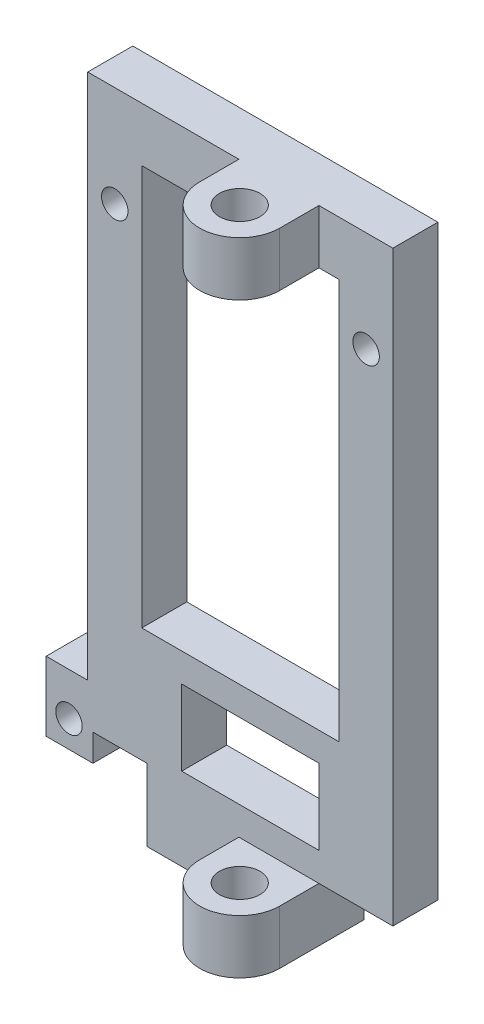
ISO-10303-21;
HEADER;
FILE_DESCRIPTION(('STEP AP214'),'2;1');
FILE_NAME('part.step','',(''),(''),'','','');
FILE_SCHEMA(('AUTOMOTIVE_DESIGN { 1 0 10303 214 1 1 1 1 }'));
ENDSEC;
DATA;
#1=APPLICATION_CONTEXT('core data for automotive mechanical design processes');
#2=APPLICATION_PROTOCOL_DEFINITION('international standard','automotive_design',2000,#1);
#3=PRODUCT_CONTEXT('',#1,'mechanical');
#4=PRODUCT('Part','Part','',(#3));
#5=PRODUCT_RELATED_PRODUCT_CATEGORY('part','',(#4));
#6=PRODUCT_DEFINITION_FORMATION('','',#4);
#7=PRODUCT_DEFINITION_CONTEXT('part definition',#1,'design');
#8=PRODUCT_DEFINITION('design','',#6,#7);
#9=PRODUCT_DEFINITION_SHAPE('','',#8);
#10=(LENGTH_UNIT() NAMED_UNIT(*) SI_UNIT(.MILLI.,.METRE.));
#11=(NAMED_UNIT(*) PLANE_ANGLE_UNIT() SI_UNIT($,.RADIAN.));
#12=(NAMED_UNIT(*) SI_UNIT($,.STERADIAN.) SOLID_ANGLE_UNIT());
#13=UNCERTAINTY_MEASURE_WITH_UNIT(LENGTH_MEASURE(1.E-05),#10,'distance_accuracy_value','');
#14=(GEOMETRIC_REPRESENTATION_CONTEXT(3) GLOBAL_UNCERTAINTY_ASSIGNED_CONTEXT((#13)) GLOBAL_UNIT_ASSIGNED_CONTEXT((#10,
#11,#12)) REPRESENTATION_CONTEXT('',''));
#15=CARTESIAN_POINT('',(0.,0.,0.));
#16=DIRECTION('',(0.,0.,1.));
#17=DIRECTION('',(1.,0.,0.));
#18=AXIS2_PLACEMENT_3D('',#15,#16,#17);
#19=CARTESIAN_POINT('',(0.,0.,5.));
#20=DIRECTION('',(0.,0.,1.));
#21=DIRECTION('',(1.,0.,0.));
#22=AXIS2_PLACEMENT_3D('',#19,#20,#21);
#23=PLANE('',#22);
#24=DIRECTION('',(1.,0.,0.));
#25=VECTOR('',#24,1.);
#26=CARTESIAN_POINT('',(0.,-14.863,5.));
#27=LINE('',#26,#25);
#28=CARTESIAN_POINT('',(-15.23,-14.863,5.));
#29=VERTEX_POINT('',#28);
#30=CARTESIAN_POINT('',(6.655,-14.863,5.));
#31=VERTEX_POINT('',#30);
#32=EDGE_CURVE('E357',#29,#31,#27,.T.);
#33=ORIENTED_EDGE('',*,*,#32,.F.);
#34=DIRECTION('',(0.,1.,0.));
#35=VECTOR('',#34,1.);
#36=CARTESIAN_POINT('',(-15.23,29.595,5.));
#37=LINE('',#36,#35);
#38=CARTESIAN_POINT('',(-15.23,29.595,5.));
#39=VERTEX_POINT('',#38);
#40=EDGE_CURVE('E490',#29,#39,#37,.T.);
#41=ORIENTED_EDGE('',*,*,#40,.T.);
#42=DIRECTION('',(-1.,0.,0.));
#43=VECTOR('',#42,1.);
#44=CARTESIAN_POINT('',(-15.65,29.595,5.));
#45=LINE('',#44,#43);
#46=CARTESIAN_POINT('',(-4.445,29.595,5.));
#47=VERTEX_POINT('',#46);
#48=EDGE_CURVE('E608',#47,#39,#45,.T.);
#49=ORIENTED_EDGE('',*,*,#48,.F.);
#50=DIRECTION('',(0.,-1.,0.));
#51=VECTOR('',#50,1.);
#52=CARTESIAN_POINT('',(-4.445,35.595,5.));
#53=LINE('',#52,#51);
#54=CARTESIAN_POINT('',(-4.445,35.595,5.));
#55=VERTEX_POINT('',#54);
#56=EDGE_CURVE('E585',#55,#47,#53,.T.);
#57=ORIENTED_EDGE('',*,*,#56,.F.);
#58=DIRECTION('',(-1.,0.,0.));
#59=VECTOR('',#58,1.);
#60=CARTESIAN_POINT('',(-21.65,35.595,5.));
#61=LINE('',#60,#59);
#62=CARTESIAN_POINT('',(-21.23,35.595,5.));
#63=VERTEX_POINT('',#62);
#64=EDGE_CURVE('E135',#55,#63,#61,.T.);
#65=ORIENTED_EDGE('',*,*,#64,.T.);
#66=DIRECTION('',(0.,1.,0.));
#67=VECTOR('',#66,1.);
#68=CARTESIAN_POINT('',(-21.23,35.595,5.));
#69=LINE('',#68,#67);
#70=CARTESIAN_POINT('',(-21.23,-22.895,5.));
#71=VERTEX_POINT('',#70);
#72=EDGE_CURVE('E480',#71,#63,#69,.T.);
#73=ORIENTED_EDGE('',*,*,#72,.F.);
#74=DIRECTION('',(1.,0.,0.));
#75=VECTOR('',#74,1.);
#76=CARTESIAN_POINT('',(-25.85,-22.895,5.));
#77=LINE('',#76,#75);
#78=CARTESIAN_POINT('',(-25.85,-22.895,5.));
#79=VERTEX_POINT('',#78);
#80=EDGE_CURVE('E454',#79,#71,#77,.T.);
#81=ORIENTED_EDGE('',*,*,#80,.F.);
#82=DIRECTION('',(0.,1.,0.));
#83=VECTOR('',#82,1.);
#84=CARTESIAN_POINT('',(-25.85,-35.595,5.));
#85=LINE('',#84,#83);
#86=CARTESIAN_POINT('',(-25.85,-30.595,5.));
#87=VERTEX_POINT('',#86);
#88=EDGE_CURVE('E441',#87,#79,#85,.T.);
#89=ORIENTED_EDGE('',*,*,#88,.F.);
#90=DIRECTION('',(1.,0.,0.));
#91=VECTOR('',#90,1.);
#92=CARTESIAN_POINT('',(0.,-30.595,5.));
#93=LINE('',#92,#91);
#94=CARTESIAN_POINT('',(-20.65,-30.595,5.));
#95=VERTEX_POINT('',#94);
#96=EDGE_CURVE('E410',#87,#95,#93,.T.);
#97=ORIENTED_EDGE('',*,*,#96,.T.);
#98=DIRECTION('',(0.,1.,0.));
#99=VECTOR('',#98,1.);
#100=CARTESIAN_POINT('',(-20.65,0.,5.));
#101=LINE('',#100,#99);
#102=CARTESIAN_POINT('',(-20.65,-27.595,5.));
#103=VERTEX_POINT('',#102);
#104=EDGE_CURVE('E387',#95,#103,#101,.T.);
#105=ORIENTED_EDGE('',*,*,#104,.T.);
#106=DIRECTION('',(-1.,0.,0.));
#107=VECTOR('',#106,1.);
#108=CARTESIAN_POINT('',(0.,-27.595,5.));
#109=LINE('',#108,#107);
#110=CARTESIAN_POINT('',(-14.65,-27.595,5.));
#111=VERTEX_POINT('',#110);
#112=EDGE_CURVE('E395',#111,#103,#109,.T.);
#113=ORIENTED_EDGE('',*,*,#112,.F.);
#114=DIRECTION('',(0.,1.,0.));
#115=VECTOR('',#114,1.);
#116=CARTESIAN_POINT('',(-14.65,0.,5.));
#117=LINE('',#116,#115);
#118=CARTESIAN_POINT('',(-14.65,-35.595,5.));
#119=VERTEX_POINT('',#118);
#120=EDGE_CURVE('E414',#119,#111,#117,.T.);
#121=ORIENTED_EDGE('',*,*,#120,.F.);
#122=DIRECTION('',(1.,0.,0.));
#123=VECTOR('',#122,1.);
#124=CARTESIAN_POINT('',(-21.65,-35.595,5.));
#125=LINE('',#124,#123);
#126=CARTESIAN_POINT('',(-4.445,-35.595,5.));
#127=VERTEX_POINT('',#126);
#128=EDGE_CURVE('E616',#119,#127,#125,.T.);
#129=ORIENTED_EDGE('',*,*,#128,.T.);
#130=DIRECTION('',(0.,-1.,0.));
#131=VECTOR('',#130,1.);
#132=CARTESIAN_POINT('',(-4.445,-29.595,5.));
#133=LINE('',#132,#131);
#134=CARTESIAN_POINT('',(-4.445,-29.595,5.));
#135=VERTEX_POINT('',#134);
#136=EDGE_CURVE('E581',#135,#127,#133,.T.);
#137=ORIENTED_EDGE('',*,*,#136,.F.);
#138=DIRECTION('',(1.,0.,0.));
#139=VECTOR('',#138,1.);
#140=CARTESIAN_POINT('',(6.655,-29.595,5.));
#141=LINE('',#140,#139);
#142=CARTESIAN_POINT('',(4.445,-29.595,5.));
#143=VERTEX_POINT('',#142);
#144=EDGE_CURVE('E475',#135,#143,#141,.T.);
#145=ORIENTED_EDGE('',*,*,#144,.T.);
#146=DIRECTION('',(-1.,0.,0.));
#147=VECTOR('',#146,1.);
#148=CARTESIAN_POINT('',(4.445,-29.595,5.));
#149=LINE('',#148,#147);
#150=CARTESIAN_POINT('',(12.65,-29.595,5.));
#151=VERTEX_POINT('',#150);
#152=EDGE_CURVE('E458',#151,#143,#149,.T.);
#153=ORIENTED_EDGE('',*,*,#152,.F.);
#154=DIRECTION('',(0.,-1.,0.));
#155=VECTOR('',#154,1.);
#156=CARTESIAN_POINT('',(12.65,35.595,5.));
#157=LINE('',#156,#155);
#158=CARTESIAN_POINT('',(12.65,35.595,5.));
#159=VERTEX_POINT('',#158);
#160=EDGE_CURVE('E506',#159,#151,#157,.T.);
#161=ORIENTED_EDGE('',*,*,#160,.F.);
#162=CARTESIAN_POINT('',(4.445,35.595,5.));
#163=VERTEX_POINT('',#162);
#164=EDGE_CURVE('E12',#159,#163,#61,.T.);
#165=ORIENTED_EDGE('',*,*,#164,.T.);
#166=DIRECTION('',(0.,-1.,0.));
#167=VECTOR('',#166,1.);
#168=CARTESIAN_POINT('',(4.445,35.595,5.));
#169=LINE('',#168,#167);
#170=CARTESIAN_POINT('',(4.445,29.595,5.));
#171=VERTEX_POINT('',#170);
#172=EDGE_CURVE('E589',#163,#171,#169,.T.);
#173=ORIENTED_EDGE('',*,*,#172,.T.);
#174=DIRECTION('',(-1.,0.,0.));
#175=VECTOR('',#174,1.);
#176=CARTESIAN_POINT('',(6.655,29.595,5.));
#177=LINE('',#176,#175);
#178=CARTESIAN_POINT('',(6.655,29.595,5.));
#179=VERTEX_POINT('',#178);
#180=EDGE_CURVE('E517',#179,#171,#177,.T.);
#181=ORIENTED_EDGE('',*,*,#180,.F.);
#182=DIRECTION('',(0.,1.,0.));
#183=VECTOR('',#182,1.);
#184=CARTESIAN_POINT('',(6.655,-29.595,5.));
#185=LINE('',#184,#183);
#186=EDGE_CURVE('E500',#31,#179,#185,.T.);
#187=ORIENTED_EDGE('',*,*,#186,.F.);
#188=EDGE_LOOP('',(#33,#41,#49,#57,#65,#73,#81,#89,#97,#105,#113,#121,#129,#137,#145,#153,#161,
#165,#173,#181,#187));
#189=FACE_BOUND('',#188,.T.);
#190=CARTESIAN_POINT('',(-18.23,24.405,5.));
#191=DIRECTION('',(0.,0.,1.));
#192=DIRECTION('',(1.,0.,0.));
#193=AXIS2_PLACEMENT_3D('',#190,#191,#192);
#194=CIRCLE('',#193,1.47);
#195=CARTESIAN_POINT('',(-16.76,24.405,5.));
#196=VERTEX_POINT('',#195);
#197=EDGE_CURVE('E372',#196,#196,#194,.T.);
#198=ORIENTED_EDGE('',*,*,#197,.F.);
#199=EDGE_LOOP('',(#198));
#200=FACE_BOUND('',#199,.T.);
#201=CARTESIAN_POINT('',(-23.31,-27.625,5.));
#202=DIRECTION('',(0.,0.,1.));
#203=DIRECTION('',(1.,0.,0.));
#204=AXIS2_PLACEMENT_3D('',#201,#202,#203);
#205=CIRCLE('',#204,1.47);
#206=CARTESIAN_POINT('',(-21.84,-27.625,5.));
#207=VERTEX_POINT('',#206);
#208=EDGE_CURVE('E371',#207,#207,#205,.T.);
#209=ORIENTED_EDGE('',*,*,#208,.F.);
#210=EDGE_LOOP('',(#209));
#211=FACE_BOUND('',#210,.T.);
#212=CARTESIAN_POINT('',(9.68,24.405,5.));
#213=DIRECTION('',(0.,0.,1.));
#214=DIRECTION('',(1.,0.,0.));
#215=AXIS2_PLACEMENT_3D('',#212,#213,#214);
#216=CIRCLE('',#215,1.47);
#217=CARTESIAN_POINT('',(11.15,24.405,5.));
#218=VERTEX_POINT('',#217);
#219=EDGE_CURVE('E346',#218,#218,#216,.T.);
#220=ORIENTED_EDGE('',*,*,#219,.F.);
#221=EDGE_LOOP('',(#220));
#222=FACE_BOUND('',#221,.T.);
#223=DIRECTION('',(-1.,0.,0.));
#224=VECTOR('',#223,1.);
#225=CARTESIAN_POINT('',(0.,-26.42,5.));
#226=LINE('',#225,#224);
#227=CARTESIAN_POINT('',(4.445,-26.42,5.));
#228=VERTEX_POINT('',#227);
#229=CARTESIAN_POINT('',(-10.795,-26.42,5.));
#230=VERTEX_POINT('',#229);
#231=EDGE_CURVE('E336',#228,#230,#226,.T.);
#232=ORIENTED_EDGE('',*,*,#231,.T.);
#233=DIRECTION('',(0.,1.,0.));
#234=VECTOR('',#233,1.);
#235=CARTESIAN_POINT('',(-10.795,0.,5.));
#236=LINE('',#235,#234);
#237=CARTESIAN_POINT('',(-10.795,-18.038,5.));
#238=VERTEX_POINT('',#237);
#239=EDGE_CURVE('E143',#230,#238,#236,.T.);
#240=ORIENTED_EDGE('',*,*,#239,.T.);
#241=DIRECTION('',(-1.,0.,0.));
#242=VECTOR('',#241,1.);
#243=CARTESIAN_POINT('',(0.,-18.038,5.));
#244=LINE('',#243,#242);
#245=CARTESIAN_POINT('',(4.445,-18.038,5.));
#246=VERTEX_POINT('',#245);
#247=EDGE_CURVE('E323',#246,#238,#244,.T.);
#248=ORIENTED_EDGE('',*,*,#247,.F.);
#249=DIRECTION('',(0.,1.,0.));
#250=VECTOR('',#249,1.);
#251=CARTESIAN_POINT('',(4.445,0.,5.));
#252=LINE('',#251,#250);
#253=EDGE_CURVE('E327',#228,#246,#252,.T.);
#254=ORIENTED_EDGE('',*,*,#253,.F.);
#255=EDGE_LOOP('',(#232,#240,#248,#254));
#256=FACE_BOUND('',#255,.T.);
#257=ADVANCED_FACE('F125',(#189,#200,#211,#222,#256),#23,.T.);
#258=CARTESIAN_POINT('',(0.,0.,0.));
#259=DIRECTION('',(0.,0.,1.));
#260=DIRECTION('',(1.,0.,0.));
#261=AXIS2_PLACEMENT_3D('',#258,#259,#260);
#262=PLANE('',#261);
#263=CARTESIAN_POINT('',(-18.23,24.405,0.));
#264=DIRECTION('',(0.,0.,1.));
#265=DIRECTION('',(1.,0.,0.));
#266=AXIS2_PLACEMENT_3D('',#263,#264,#265);
#267=CIRCLE('',#266,1.47);
#268=CARTESIAN_POINT('',(-16.76,24.405,0.));
#269=VERTEX_POINT('',#268);
#270=EDGE_CURVE('E367',#269,#269,#267,.T.);
#271=ORIENTED_EDGE('',*,*,#270,.T.);
#272=EDGE_LOOP('',(#271));
#273=FACE_BOUND('',#272,.T.);
#274=CARTESIAN_POINT('',(9.68,24.405,0.));
#275=DIRECTION('',(0.,0.,1.));
#276=DIRECTION('',(1.,0.,0.));
#277=AXIS2_PLACEMENT_3D('',#274,#275,#276);
#278=CIRCLE('',#277,1.47);
#279=CARTESIAN_POINT('',(11.15,24.405,0.));
#280=VERTEX_POINT('',#279);
#281=EDGE_CURVE('E376',#280,#280,#278,.T.);
#282=ORIENTED_EDGE('',*,*,#281,.T.);
#283=EDGE_LOOP('',(#282));
#284=FACE_BOUND('',#283,.T.);
#285=CARTESIAN_POINT('',(-23.31,-27.625,0.));
#286=DIRECTION('',(0.,0.,1.));
#287=DIRECTION('',(1.,0.,0.));
#288=AXIS2_PLACEMENT_3D('',#285,#286,#287);
#289=CIRCLE('',#288,1.47);
#290=CARTESIAN_POINT('',(-21.84,-27.625,0.));
#291=VERTEX_POINT('',#290);
#292=EDGE_CURVE('E383',#291,#291,#289,.T.);
#293=ORIENTED_EDGE('',*,*,#292,.T.);
#294=EDGE_LOOP('',(#293));
#295=FACE_BOUND('',#294,.T.);
#296=DIRECTION('',(1.,0.,0.));
#297=VECTOR('',#296,1.);
#298=CARTESIAN_POINT('',(-21.65,-35.595,0.));
#299=LINE('',#298,#297);
#300=CARTESIAN_POINT('',(-14.65,-35.595,0.));
#301=VERTEX_POINT('',#300);
#302=CARTESIAN_POINT('',(4.445,-35.595,0.));
#303=VERTEX_POINT('',#302);
#304=EDGE_CURVE('E612',#301,#303,#299,.T.);
#305=ORIENTED_EDGE('',*,*,#304,.F.);
#306=DIRECTION('',(0.,1.,0.));
#307=VECTOR('',#306,1.);
#308=CARTESIAN_POINT('',(-14.65,0.,0.));
#309=LINE('',#308,#307);
#310=CARTESIAN_POINT('',(-14.65,-27.595,0.));
#311=VERTEX_POINT('',#310);
#312=EDGE_CURVE('E398',#301,#311,#309,.T.);
#313=ORIENTED_EDGE('',*,*,#312,.T.);
#314=DIRECTION('',(-1.,0.,0.));
#315=VECTOR('',#314,1.);
#316=CARTESIAN_POINT('',(0.,-27.595,0.));
#317=LINE('',#316,#315);
#318=CARTESIAN_POINT('',(-20.65,-27.595,0.));
#319=VERTEX_POINT('',#318);
#320=EDGE_CURVE('E402',#311,#319,#317,.T.);
#321=ORIENTED_EDGE('',*,*,#320,.T.);
#322=DIRECTION('',(0.,1.,0.));
#323=VECTOR('',#322,1.);
#324=CARTESIAN_POINT('',(-20.65,0.,0.));
#325=LINE('',#324,#323);
#326=CARTESIAN_POINT('',(-20.65,-30.595,0.));
#327=VERTEX_POINT('',#326);
#328=EDGE_CURVE('E391',#327,#319,#325,.T.);
#329=ORIENTED_EDGE('',*,*,#328,.F.);
#330=DIRECTION('',(1.,0.,0.));
#331=VECTOR('',#330,1.);
#332=CARTESIAN_POINT('',(0.,-30.595,0.));
#333=LINE('',#332,#331);
#334=CARTESIAN_POINT('',(-25.85,-30.595,0.));
#335=VERTEX_POINT('',#334);
#336=EDGE_CURVE('E394',#335,#327,#333,.T.);
#337=ORIENTED_EDGE('',*,*,#336,.F.);
#338=DIRECTION('',(0.,-1.,0.));
#339=VECTOR('',#338,1.);
#340=CARTESIAN_POINT('',(-25.85,-35.595,0.));
#341=LINE('',#340,#339);
#342=CARTESIAN_POINT('',(-25.85,-22.895,0.));
#343=VERTEX_POINT('',#342);
#344=EDGE_CURVE('E437',#343,#335,#341,.T.);
#345=ORIENTED_EDGE('',*,*,#344,.F.);
#346=DIRECTION('',(1.,0.,0.));
#347=VECTOR('',#346,1.);
#348=CARTESIAN_POINT('',(-25.85,-22.895,0.));
#349=LINE('',#348,#347);
#350=CARTESIAN_POINT('',(-21.23,-22.895,0.));
#351=VERTEX_POINT('',#350);
#352=EDGE_CURVE('E447',#343,#351,#349,.T.);
#353=ORIENTED_EDGE('',*,*,#352,.T.);
#354=DIRECTION('',(0.,1.,0.));
#355=VECTOR('',#354,1.);
#356=CARTESIAN_POINT('',(-21.23,35.595,0.));
#357=LINE('',#356,#355);
#358=CARTESIAN_POINT('',(-21.23,35.595,0.));
#359=VERTEX_POINT('',#358);
#360=EDGE_CURVE('E481',#351,#359,#357,.T.);
#361=ORIENTED_EDGE('',*,*,#360,.T.);
#362=DIRECTION('',(-1.,0.,0.));
#363=VECTOR('',#362,1.);
#364=CARTESIAN_POINT('',(-21.65,35.595,0.));
#365=LINE('',#364,#363);
#366=CARTESIAN_POINT('',(12.65,35.595,0.));
#367=VERTEX_POINT('',#366);
#368=EDGE_CURVE('E618',#367,#359,#365,.T.);
#369=ORIENTED_EDGE('',*,*,#368,.F.);
#370=DIRECTION('',(0.,-1.,0.));
#371=VECTOR('',#370,1.);
#372=CARTESIAN_POINT('',(12.65,35.595,0.));
#373=LINE('',#372,#371);
#374=CARTESIAN_POINT('',(12.65,-29.595,0.));
#375=VERTEX_POINT('',#374);
#376=EDGE_CURVE('E501',#367,#375,#373,.T.);
#377=ORIENTED_EDGE('',*,*,#376,.T.);
#378=DIRECTION('',(-1.,0.,0.));
#379=VECTOR('',#378,1.);
#380=CARTESIAN_POINT('',(4.445,-29.595,0.));
#381=LINE('',#380,#379);
#382=CARTESIAN_POINT('',(4.445,-29.595,0.));
#383=VERTEX_POINT('',#382);
#384=EDGE_CURVE('E463',#375,#383,#381,.T.);
#385=ORIENTED_EDGE('',*,*,#384,.T.);
#386=DIRECTION('',(0.,-1.,0.));
#387=VECTOR('',#386,1.);
#388=CARTESIAN_POINT('',(4.445,-35.595,0.));
#389=LINE('',#388,#387);
#390=EDGE_CURVE('E459',#383,#303,#389,.T.);
#391=ORIENTED_EDGE('',*,*,#390,.T.);
#392=EDGE_LOOP('',(#305,#313,#321,#329,#337,#345,#353,#361,#369,#377,#385,#391));
#393=FACE_BOUND('',#392,.T.);
#394=DIRECTION('',(0.,1.,0.));
#395=VECTOR('',#394,1.);
#396=CARTESIAN_POINT('',(-15.23,29.595,0.));
#397=LINE('',#396,#395);
#398=CARTESIAN_POINT('',(-15.23,-14.863,0.));
#399=VERTEX_POINT('',#398);
#400=CARTESIAN_POINT('',(-15.23,29.595,0.));
#401=VERTEX_POINT('',#400);
#402=EDGE_CURVE('E491',#399,#401,#397,.T.);
#403=ORIENTED_EDGE('',*,*,#402,.F.);
#404=DIRECTION('',(1.,0.,0.));
#405=VECTOR('',#404,1.);
#406=CARTESIAN_POINT('',(0.,-14.863,0.));
#407=LINE('',#406,#405);
#408=CARTESIAN_POINT('',(6.655,-14.863,0.));
#409=VERTEX_POINT('',#408);
#410=EDGE_CURVE('E352',#399,#409,#407,.T.);
#411=ORIENTED_EDGE('',*,*,#410,.T.);
#412=DIRECTION('',(0.,1.,0.));
#413=VECTOR('',#412,1.);
#414=CARTESIAN_POINT('',(6.655,-29.595,0.));
#415=LINE('',#414,#413);
#416=CARTESIAN_POINT('',(6.655,29.595,0.));
#417=VERTEX_POINT('',#416);
#418=EDGE_CURVE('E514',#409,#417,#415,.T.);
#419=ORIENTED_EDGE('',*,*,#418,.T.);
#420=DIRECTION('',(-1.,0.,0.));
#421=VECTOR('',#420,1.);
#422=CARTESIAN_POINT('',(-15.65,29.595,0.));
#423=LINE('',#422,#421);
#424=EDGE_CURVE('E607',#417,#401,#423,.T.);
#425=ORIENTED_EDGE('',*,*,#424,.T.);
#426=EDGE_LOOP('',(#403,#411,#419,#425));
#427=FACE_BOUND('',#426,.T.);
#428=DIRECTION('',(0.,1.,0.));
#429=VECTOR('',#428,1.);
#430=CARTESIAN_POINT('',(-10.795,0.,0.));
#431=LINE('',#430,#429);
#432=CARTESIAN_POINT('',(-10.795,-26.42,0.));
#433=VERTEX_POINT('',#432);
#434=CARTESIAN_POINT('',(-10.795,-18.038,0.));
#435=VERTEX_POINT('',#434);
#436=EDGE_CURVE('E312',#433,#435,#431,.T.);
#437=ORIENTED_EDGE('',*,*,#436,.F.);
#438=DIRECTION('',(-1.,0.,0.));
#439=VECTOR('',#438,1.);
#440=CARTESIAN_POINT('',(0.,-26.42,0.));
#441=LINE('',#440,#439);
#442=CARTESIAN_POINT('',(4.445,-26.42,0.));
#443=VERTEX_POINT('',#442);
#444=EDGE_CURVE('E303',#443,#433,#441,.T.);
#445=ORIENTED_EDGE('',*,*,#444,.F.);
#446=DIRECTION('',(0.,1.,0.));
#447=VECTOR('',#446,1.);
#448=CARTESIAN_POINT('',(4.445,0.,0.));
#449=LINE('',#448,#447);
#450=CARTESIAN_POINT('',(4.445,-18.038,0.));
#451=VERTEX_POINT('',#450);
#452=EDGE_CURVE('E151',#443,#451,#449,.T.);
#453=ORIENTED_EDGE('',*,*,#452,.T.);
#454=DIRECTION('',(-1.,0.,0.));
#455=VECTOR('',#454,1.);
#456=CARTESIAN_POINT('',(0.,-18.038,0.));
#457=LINE('',#456,#455);
#458=EDGE_CURVE('E317',#451,#435,#457,.T.);
#459=ORIENTED_EDGE('',*,*,#458,.T.);
#460=EDGE_LOOP('',(#437,#445,#453,#459));
#461=FACE_BOUND('',#460,.T.);
#462=ADVANCED_FACE('F320',(#273,#284,#295,#393,#427,#461),#262,.F.);
#463=CARTESIAN_POINT('',(-25.85,0.,0.));
#464=DIRECTION('',(1.,0.,0.));
#465=DIRECTION('',(0.,0.,-1.));
#466=AXIS2_PLACEMENT_3D('',#463,#464,#465);
#467=PLANE('',#466);
#468=DIRECTION('',(0.,0.,1.));
#469=VECTOR('',#468,1.);
#470=CARTESIAN_POINT('',(-25.85,-30.595,0.));
#471=LINE('',#470,#469);
#472=EDGE_CURVE('E431',#335,#87,#471,.T.);
#473=ORIENTED_EDGE('',*,*,#472,.T.);
#474=ORIENTED_EDGE('',*,*,#88,.T.);
#475=DIRECTION('',(0.,0.,-1.));
#476=VECTOR('',#475,1.);
#477=CARTESIAN_POINT('',(-25.85,-22.895,0.));
#478=LINE('',#477,#476);
#479=EDGE_CURVE('E444',#79,#343,#478,.T.);
#480=ORIENTED_EDGE('',*,*,#479,.T.);
#481=ORIENTED_EDGE('',*,*,#344,.T.);
#482=EDGE_LOOP('',(#473,#474,#480,#481));
#483=FACE_BOUND('',#482,.T.);
#484=ADVANCED_FACE('F657',(#483),#467,.F.);
#485=CARTESIAN_POINT('',(-21.23,35.595,0.));
#486=DIRECTION('',(1.,0.,0.));
#487=DIRECTION('',(0.,1.,0.));
#488=AXIS2_PLACEMENT_3D('',#485,#486,#487);
#489=PLANE('',#488);
#490=DIRECTION('',(0.,0.,-1.));
#491=VECTOR('',#490,1.);
#492=CARTESIAN_POINT('',(-21.23,-22.895,0.));
#493=LINE('',#492,#491);
#494=EDGE_CURVE('E424',#71,#351,#493,.T.);
#495=ORIENTED_EDGE('',*,*,#494,.F.);
#496=ORIENTED_EDGE('',*,*,#72,.T.);
#497=DIRECTION('',(0.,0.,1.));
#498=VECTOR('',#497,1.);
#499=CARTESIAN_POINT('',(-21.23,35.595,0.));
#500=LINE('',#499,#498);
#501=EDGE_CURVE('E484',#359,#63,#500,.T.);
#502=ORIENTED_EDGE('',*,*,#501,.F.);
#503=ORIENTED_EDGE('',*,*,#360,.F.);
#504=EDGE_LOOP('',(#495,#496,#502,#503));
#505=FACE_BOUND('',#504,.T.);
#506=ADVANCED_FACE('F667',(#505),#489,.F.);
#507=CARTESIAN_POINT('',(-21.65,-35.595,5.));
#508=DIRECTION('',(0.,1.,0.));
#509=DIRECTION('',(0.,0.,1.));
#510=AXIS2_PLACEMENT_3D('',#507,#508,#509);
#511=PLANE('',#510);
#512=ORIENTED_EDGE('',*,*,#128,.F.);
#513=DIRECTION('',(0.,0.,1.));
#514=VECTOR('',#513,1.);
#515=CARTESIAN_POINT('',(-14.65,-35.595,0.));
#516=LINE('',#515,#514);
#517=EDGE_CURVE('E428',#301,#119,#516,.T.);
#518=ORIENTED_EDGE('',*,*,#517,.F.);
#519=ORIENTED_EDGE('',*,*,#304,.T.);
#520=DIRECTION('',(0.,0.,-1.));
#521=VECTOR('',#520,1.);
#522=CARTESIAN_POINT('',(4.445,-35.595,13.8));
#523=LINE('',#522,#521);
#524=CARTESIAN_POINT('',(4.445,-35.595,9.40000000000001));
#525=VERTEX_POINT('',#524);
#526=EDGE_CURVE('E569',#525,#303,#523,.T.);
#527=ORIENTED_EDGE('',*,*,#526,.F.);
#528=CARTESIAN_POINT('',(0.,-35.595,9.35476988636363));
#529=DIRECTION('',(0.,1.,0.));
#530=DIRECTION('',(0.,0.,1.));
#531=AXIS2_PLACEMENT_3D('',#528,#529,#530);
#532=CIRCLE('',#531,4.44523011363636);
#533=CARTESIAN_POINT('',(-4.445,-35.595,9.40000000000001));
#534=VERTEX_POINT('',#533);
#535=EDGE_CURVE('E546',#525,#534,#532,.F.);
#536=ORIENTED_EDGE('',*,*,#535,.T.);
#537=DIRECTION('',(0.,0.,-1.));
#538=VECTOR('',#537,1.);
#539=CARTESIAN_POINT('',(-4.445,-35.595,13.8));
#540=LINE('',#539,#538);
#541=EDGE_CURVE('E565',#534,#127,#540,.T.);
#542=ORIENTED_EDGE('',*,*,#541,.T.);
#543=EDGE_LOOP('',(#512,#518,#519,#527,#536,#542));
#544=FACE_BOUND('',#543,.T.);
#545=CARTESIAN_POINT('',(0.,-35.595,9.35476988636363));
#546=DIRECTION('',(0.,1.,0.));
#547=DIRECTION('',(0.,0.,1.));
#548=AXIS2_PLACEMENT_3D('',#545,#546,#547);
#549=CIRCLE('',#548,2.2479);
#550=CARTESIAN_POINT('',(0.,-35.595,11.6026698863636));
#551=VERTEX_POINT('',#550);
#552=EDGE_CURVE('E513',#551,#551,#549,.T.);
#553=ORIENTED_EDGE('',*,*,#552,.T.);
#554=EDGE_LOOP('',(#553));
#555=FACE_BOUND('',#554,.T.);
#556=ADVANCED_FACE('F127',(#544,#555),#511,.F.);
#557=CARTESIAN_POINT('',(-21.65,35.595,5.));
#558=DIRECTION('',(0.,-1.,0.));
#559=DIRECTION('',(0.,0.,-1.));
#560=AXIS2_PLACEMENT_3D('',#557,#558,#559);
#561=PLANE('',#560);
#562=ORIENTED_EDGE('',*,*,#368,.T.);
#563=ORIENTED_EDGE('',*,*,#501,.T.);
#564=ORIENTED_EDGE('',*,*,#64,.F.);
#565=DIRECTION('',(0.,0.,-1.));
#566=VECTOR('',#565,1.);
#567=CARTESIAN_POINT('',(-4.445,35.595,13.8));
#568=LINE('',#567,#566);
#569=CARTESIAN_POINT('',(-4.445,35.595,9.40000000000001));
#570=VERTEX_POINT('',#569);
#571=EDGE_CURVE('E593',#570,#55,#568,.T.);
#572=ORIENTED_EDGE('',*,*,#571,.F.);
#573=CARTESIAN_POINT('',(0.,35.595,9.35476988636363));
#574=DIRECTION('',(0.,1.,0.));
#575=DIRECTION('',(0.,0.,1.));
#576=AXIS2_PLACEMENT_3D('',#573,#574,#575);
#577=CIRCLE('',#576,4.44523011363636);
#578=CARTESIAN_POINT('',(4.445,35.595,9.40000000000001));
#579=VERTEX_POINT('',#578);
#580=EDGE_CURVE('E129',#579,#570,#577,.F.);
#581=ORIENTED_EDGE('',*,*,#580,.F.);
#582=DIRECTION('',(0.,0.,-1.));
#583=VECTOR('',#582,1.);
#584=CARTESIAN_POINT('',(4.445,35.595,13.8));
#585=LINE('',#584,#583);
#586=EDGE_CURVE('E596',#579,#163,#585,.T.);
#587=ORIENTED_EDGE('',*,*,#586,.T.);
#588=ORIENTED_EDGE('',*,*,#164,.F.);
#589=DIRECTION('',(0.,0.,1.));
#590=VECTOR('',#589,1.);
#591=CARTESIAN_POINT('',(12.65,35.595,0.));
#592=LINE('',#591,#590);
#593=EDGE_CURVE('E505',#367,#159,#592,.T.);
#594=ORIENTED_EDGE('',*,*,#593,.F.);
#595=EDGE_LOOP('',(#562,#563,#564,#572,#581,#587,#588,#594));
#596=FACE_BOUND('',#595,.T.);
#597=CARTESIAN_POINT('',(0.,35.595,9.35476988636363));
#598=DIRECTION('',(0.,-1.,0.));
#599=DIRECTION('',(0.,0.,-1.));
#600=AXIS2_PLACEMENT_3D('',#597,#598,#599);
#601=CIRCLE('',#600,2.2479);
#602=CARTESIAN_POINT('',(0.,35.595,7.10686988636363));
#603=VERTEX_POINT('',#602);
#604=EDGE_CURVE('E542',#603,#603,#601,.T.);
#605=ORIENTED_EDGE('',*,*,#604,.T.);
#606=EDGE_LOOP('',(#605));
#607=FACE_BOUND('',#606,.T.);
#608=ADVANCED_FACE('F646',(#596,#607),#561,.F.);
#609=CARTESIAN_POINT('',(-15.65,-29.595,5.));
#610=DIRECTION('',(0.,1.,0.));
#611=DIRECTION('',(0.,0.,1.));
#612=AXIS2_PLACEMENT_3D('',#609,#610,#611);
#613=PLANE('',#612);
#614=ORIENTED_EDGE('',*,*,#144,.F.);
#615=DIRECTION('',(0.,0.,-1.));
#616=VECTOR('',#615,1.);
#617=CARTESIAN_POINT('',(-4.445,-29.595,13.8));
#618=LINE('',#617,#616);
#619=CARTESIAN_POINT('',(-4.445,-29.595,9.40000000000001));
#620=VERTEX_POINT('',#619);
#621=EDGE_CURVE('E577',#620,#135,#618,.T.);
#622=ORIENTED_EDGE('',*,*,#621,.F.);
#623=CARTESIAN_POINT('',(0.,-29.595,9.35476988636363));
#624=DIRECTION('',(0.,1.,0.));
#625=DIRECTION('',(0.,0.,1.));
#626=AXIS2_PLACEMENT_3D('',#623,#624,#625);
#627=CIRCLE('',#626,4.44523011363636);
#628=CARTESIAN_POINT('',(4.445,-29.595,9.40000000000001));
#629=VERTEX_POINT('',#628);
#630=EDGE_CURVE('E562',#629,#620,#627,.F.);
#631=ORIENTED_EDGE('',*,*,#630,.F.);
#632=DIRECTION('',(0.,0.,-1.));
#633=VECTOR('',#632,1.);
#634=CARTESIAN_POINT('',(4.445,-29.595,13.8));
#635=LINE('',#634,#633);
#636=EDGE_CURVE('E573',#629,#143,#635,.T.);
#637=ORIENTED_EDGE('',*,*,#636,.T.);
#638=EDGE_LOOP('',(#614,#622,#631,#637));
#639=FACE_BOUND('',#638,.T.);
#640=CARTESIAN_POINT('',(0.,-29.595,9.35476988636363));
#641=DIRECTION('',(0.,1.,0.));
#642=DIRECTION('',(0.,0.,1.));
#643=AXIS2_PLACEMENT_3D('',#640,#641,#642);
#644=CIRCLE('',#643,2.2479);
#645=CARTESIAN_POINT('',(0.,-29.595,11.6026698863636));
#646=VERTEX_POINT('',#645);
#647=EDGE_CURVE('E538',#646,#646,#644,.T.);
#648=ORIENTED_EDGE('',*,*,#647,.F.);
#649=EDGE_LOOP('',(#648));
#650=FACE_BOUND('',#649,.T.);
#651=ADVANCED_FACE('F634',(#639,#650),#613,.T.);
#652=CARTESIAN_POINT('',(-15.65,29.595,5.));
#653=DIRECTION('',(0.,-1.,0.));
#654=DIRECTION('',(0.,0.,-1.));
#655=AXIS2_PLACEMENT_3D('',#652,#653,#654);
#656=PLANE('',#655);
#657=DIRECTION('',(0.,0.,1.));
#658=VECTOR('',#657,1.);
#659=CARTESIAN_POINT('',(-15.23,29.595,0.));
#660=LINE('',#659,#658);
#661=EDGE_CURVE('E494',#401,#39,#660,.T.);
#662=ORIENTED_EDGE('',*,*,#661,.F.);
#663=ORIENTED_EDGE('',*,*,#424,.F.);
#664=DIRECTION('',(0.,0.,1.));
#665=VECTOR('',#664,1.);
#666=CARTESIAN_POINT('',(6.655,29.595,0.));
#667=LINE('',#666,#665);
#668=EDGE_CURVE('E510',#417,#179,#667,.T.);
#669=ORIENTED_EDGE('',*,*,#668,.T.);
#670=ORIENTED_EDGE('',*,*,#180,.T.);
#671=DIRECTION('',(0.,0.,-1.));
#672=VECTOR('',#671,1.);
#673=CARTESIAN_POINT('',(4.445,29.595,13.8));
#674=LINE('',#673,#672);
#675=CARTESIAN_POINT('',(4.445,29.595,9.40000000000001));
#676=VERTEX_POINT('',#675);
#677=EDGE_CURVE('E600',#676,#171,#674,.T.);
#678=ORIENTED_EDGE('',*,*,#677,.F.);
#679=CARTESIAN_POINT('',(0.,29.595,9.35476988636363));
#680=DIRECTION('',(0.,-1.,0.));
#681=DIRECTION('',(0.,0.,-1.));
#682=AXIS2_PLACEMENT_3D('',#679,#680,#681);
#683=CIRCLE('',#682,4.44523011363636);
#684=CARTESIAN_POINT('',(-4.445,29.595,9.40000000000001));
#685=VERTEX_POINT('',#684);
#686=EDGE_CURVE('E555',#685,#676,#683,.F.);
#687=ORIENTED_EDGE('',*,*,#686,.F.);
#688=DIRECTION('',(0.,0.,-1.));
#689=VECTOR('',#688,1.);
#690=CARTESIAN_POINT('',(-4.445,29.595,13.8));
#691=LINE('',#690,#689);
#692=EDGE_CURVE('E604',#685,#47,#691,.T.);
#693=ORIENTED_EDGE('',*,*,#692,.T.);
#694=ORIENTED_EDGE('',*,*,#48,.T.);
#695=EDGE_LOOP('',(#662,#663,#669,#670,#678,#687,#693,#694));
#696=FACE_BOUND('',#695,.T.);
#697=CARTESIAN_POINT('',(0.,29.595,9.35476988636363));
#698=DIRECTION('',(0.,-1.,0.));
#699=DIRECTION('',(0.,0.,-1.));
#700=AXIS2_PLACEMENT_3D('',#697,#698,#699);
#701=CIRCLE('',#700,2.2479);
#702=CARTESIAN_POINT('',(0.,29.595,7.10686988636363));
#703=VERTEX_POINT('',#702);
#704=EDGE_CURVE('E533',#703,#703,#701,.T.);
#705=ORIENTED_EDGE('',*,*,#704,.F.);
#706=EDGE_LOOP('',(#705));
#707=FACE_BOUND('',#706,.T.);
#708=ADVANCED_FACE('F631',(#696,#707),#656,.T.);
#709=CARTESIAN_POINT('',(-4.445,35.595,13.8));
#710=DIRECTION('',(1.,0.,0.));
#711=DIRECTION('',(0.,1.,0.));
#712=AXIS2_PLACEMENT_3D('',#709,#710,#711);
#713=PLANE('',#712);
#714=ORIENTED_EDGE('',*,*,#692,.F.);
#715=DIRECTION('',(0.,1.,0.));
#716=VECTOR('',#715,1.);
#717=CARTESIAN_POINT('',(-4.445,-35.595,9.40000000000001));
#718=LINE('',#717,#716);
#719=EDGE_CURVE('E550',#685,#570,#718,.T.);
#720=ORIENTED_EDGE('',*,*,#719,.T.);
#721=ORIENTED_EDGE('',*,*,#571,.T.);
#722=ORIENTED_EDGE('',*,*,#56,.T.);
#723=EDGE_LOOP('',(#714,#720,#721,#722));
#724=FACE_BOUND('',#723,.T.);
#725=ADVANCED_FACE('F633',(#724),#713,.F.);
#726=CARTESIAN_POINT('',(4.445,35.595,13.8));
#727=DIRECTION('',(1.,0.,0.));
#728=DIRECTION('',(0.,1.,0.));
#729=AXIS2_PLACEMENT_3D('',#726,#727,#728);
#730=PLANE('',#729);
#731=DIRECTION('',(0.,1.,0.));
#732=VECTOR('',#731,1.);
#733=CARTESIAN_POINT('',(4.445,-35.595,9.40000000000001));
#734=LINE('',#733,#732);
#735=EDGE_CURVE('E528',#676,#579,#734,.T.);
#736=ORIENTED_EDGE('',*,*,#735,.F.);
#737=ORIENTED_EDGE('',*,*,#677,.T.);
#738=ORIENTED_EDGE('',*,*,#172,.F.);
#739=ORIENTED_EDGE('',*,*,#586,.F.);
#740=EDGE_LOOP('',(#736,#737,#738,#739));
#741=FACE_BOUND('',#740,.T.);
#742=ADVANCED_FACE('F642',(#741),#730,.T.);
#743=CARTESIAN_POINT('',(-4.445,-29.595,13.8));
#744=DIRECTION('',(1.,0.,0.));
#745=DIRECTION('',(0.,0.,-1.));
#746=AXIS2_PLACEMENT_3D('',#743,#744,#745);
#747=PLANE('',#746);
#748=ORIENTED_EDGE('',*,*,#541,.F.);
#749=EDGE_CURVE('E551',#534,#620,#718,.T.);
#750=ORIENTED_EDGE('',*,*,#749,.T.);
#751=ORIENTED_EDGE('',*,*,#621,.T.);
#752=ORIENTED_EDGE('',*,*,#136,.T.);
#753=EDGE_LOOP('',(#748,#750,#751,#752));
#754=FACE_BOUND('',#753,.T.);
#755=ADVANCED_FACE('F689',(#754),#747,.F.);
#756=CARTESIAN_POINT('',(4.445,-29.595,13.8));
#757=DIRECTION('',(1.,0.,0.));
#758=DIRECTION('',(0.,0.,-1.));
#759=AXIS2_PLACEMENT_3D('',#756,#757,#758);
#760=PLANE('',#759);
#761=EDGE_CURVE('E529',#525,#629,#734,.T.);
#762=ORIENTED_EDGE('',*,*,#761,.F.);
#763=ORIENTED_EDGE('',*,*,#526,.T.);
#764=ORIENTED_EDGE('',*,*,#390,.F.);
#765=DIRECTION('',(0.,0.,1.));
#766=VECTOR('',#765,1.);
#767=CARTESIAN_POINT('',(4.445,-29.595,0.));
#768=LINE('',#767,#766);
#769=EDGE_CURVE('E471',#383,#143,#768,.T.);
#770=ORIENTED_EDGE('',*,*,#769,.T.);
#771=ORIENTED_EDGE('',*,*,#636,.F.);
#772=EDGE_LOOP('',(#762,#763,#764,#770,#771));
#773=FACE_BOUND('',#772,.T.);
#774=ADVANCED_FACE('F692',(#773),#760,.T.);
#775=CARTESIAN_POINT('',(0.,-35.595,9.35476988636363));
#776=DIRECTION('',(0.,1.,0.));
#777=DIRECTION('',(0.,0.,1.));
#778=AXIS2_PLACEMENT_3D('',#775,#776,#777);
#779=CYLINDRICAL_SURFACE('',#778,4.44523011363636);
#780=ORIENTED_EDGE('',*,*,#630,.T.);
#781=ORIENTED_EDGE('',*,*,#749,.F.);
#782=ORIENTED_EDGE('',*,*,#535,.F.);
#783=ORIENTED_EDGE('',*,*,#761,.T.);
#784=EDGE_LOOP('',(#780,#781,#782,#783));
#785=FACE_BOUND('',#784,.T.);
#786=ADVANCED_FACE('F683',(#785),#779,.T.);
#787=ORIENTED_EDGE('',*,*,#719,.F.);
#788=ORIENTED_EDGE('',*,*,#686,.T.);
#789=ORIENTED_EDGE('',*,*,#735,.T.);
#790=ORIENTED_EDGE('',*,*,#580,.T.);
#791=EDGE_LOOP('',(#787,#788,#789,#790));
#792=FACE_BOUND('',#791,.T.);
#793=ADVANCED_FACE('F675',(#792),#779,.T.);
#794=CARTESIAN_POINT('',(0.,-35.595,9.35476988636363));
#795=DIRECTION('',(0.,1.,0.));
#796=DIRECTION('',(0.,0.,1.));
#797=AXIS2_PLACEMENT_3D('',#794,#795,#796);
#798=CYLINDRICAL_SURFACE('',#797,2.2479);
#799=ORIENTED_EDGE('',*,*,#704,.T.);
#800=EDGE_LOOP('',(#799));
#801=FACE_BOUND('',#800,.T.);
#802=ORIENTED_EDGE('',*,*,#604,.F.);
#803=EDGE_LOOP('',(#802));
#804=FACE_BOUND('',#803,.T.);
#805=ADVANCED_FACE('F628',(#801,#804),#798,.F.);
#806=ORIENTED_EDGE('',*,*,#647,.T.);
#807=EDGE_LOOP('',(#806));
#808=FACE_BOUND('',#807,.T.);
#809=ORIENTED_EDGE('',*,*,#552,.F.);
#810=EDGE_LOOP('',(#809));
#811=FACE_BOUND('',#810,.T.);
#812=ADVANCED_FACE('F674',(#808,#811),#798,.F.);
#813=CARTESIAN_POINT('',(6.655,-29.595,0.));
#814=DIRECTION('',(1.,0.,0.));
#815=DIRECTION('',(0.,0.,-1.));
#816=AXIS2_PLACEMENT_3D('',#813,#814,#815);
#817=PLANE('',#816);
#818=ORIENTED_EDGE('',*,*,#418,.F.);
#819=DIRECTION('',(0.,0.,1.));
#820=VECTOR('',#819,1.);
#821=CARTESIAN_POINT('',(6.655,-14.863,0.));
#822=LINE('',#821,#820);
#823=EDGE_CURVE('E337',#409,#31,#822,.T.);
#824=ORIENTED_EDGE('',*,*,#823,.T.);
#825=ORIENTED_EDGE('',*,*,#186,.T.);
#826=ORIENTED_EDGE('',*,*,#668,.F.);
#827=EDGE_LOOP('',(#818,#824,#825,#826));
#828=FACE_BOUND('',#827,.T.);
#829=ADVANCED_FACE('F681',(#828),#817,.F.);
#830=CARTESIAN_POINT('',(12.65,35.595,0.));
#831=DIRECTION('',(-1.,0.,0.));
#832=DIRECTION('',(0.,-1.,0.));
#833=AXIS2_PLACEMENT_3D('',#830,#831,#832);
#834=PLANE('',#833);
#835=ORIENTED_EDGE('',*,*,#160,.T.);
#836=DIRECTION('',(0.,0.,1.));
#837=VECTOR('',#836,1.);
#838=CARTESIAN_POINT('',(12.65,-29.595,0.));
#839=LINE('',#838,#837);
#840=EDGE_CURVE('E467',#375,#151,#839,.T.);
#841=ORIENTED_EDGE('',*,*,#840,.F.);
#842=ORIENTED_EDGE('',*,*,#376,.F.);
#843=ORIENTED_EDGE('',*,*,#593,.T.);
#844=EDGE_LOOP('',(#835,#841,#842,#843));
#845=FACE_BOUND('',#844,.T.);
#846=ADVANCED_FACE('F765',(#845),#834,.F.);
#847=CARTESIAN_POINT('',(-15.23,29.595,0.));
#848=DIRECTION('',(1.,0.,0.));
#849=DIRECTION('',(0.,1.,0.));
#850=AXIS2_PLACEMENT_3D('',#847,#848,#849);
#851=PLANE('',#850);
#852=ORIENTED_EDGE('',*,*,#40,.F.);
#853=DIRECTION('',(0.,0.,1.));
#854=VECTOR('',#853,1.);
#855=CARTESIAN_POINT('',(-15.23,-14.863,0.));
#856=LINE('',#855,#854);
#857=EDGE_CURVE('E356',#399,#29,#856,.T.);
#858=ORIENTED_EDGE('',*,*,#857,.F.);
#859=ORIENTED_EDGE('',*,*,#402,.T.);
#860=ORIENTED_EDGE('',*,*,#661,.T.);
#861=EDGE_LOOP('',(#852,#858,#859,#860));
#862=FACE_BOUND('',#861,.T.);
#863=ADVANCED_FACE('F767',(#862),#851,.T.);
#864=CARTESIAN_POINT('',(4.445,-29.595,0.));
#865=DIRECTION('',(0.,1.,0.));
#866=DIRECTION('',(0.,0.,1.));
#867=AXIS2_PLACEMENT_3D('',#864,#865,#866);
#868=PLANE('',#867);
#869=ORIENTED_EDGE('',*,*,#152,.T.);
#870=ORIENTED_EDGE('',*,*,#769,.F.);
#871=ORIENTED_EDGE('',*,*,#384,.F.);
#872=ORIENTED_EDGE('',*,*,#840,.T.);
#873=EDGE_LOOP('',(#869,#870,#871,#872));
#874=FACE_BOUND('',#873,.T.);
#875=ADVANCED_FACE('F760',(#874),#868,.F.);
#876=CARTESIAN_POINT('',(-25.85,-22.895,0.));
#877=DIRECTION('',(0.,-1.,0.));
#878=DIRECTION('',(1.,0.,0.));
#879=AXIS2_PLACEMENT_3D('',#876,#877,#878);
#880=PLANE('',#879);
#881=ORIENTED_EDGE('',*,*,#494,.T.);
#882=ORIENTED_EDGE('',*,*,#352,.F.);
#883=ORIENTED_EDGE('',*,*,#479,.F.);
#884=ORIENTED_EDGE('',*,*,#80,.T.);
#885=EDGE_LOOP('',(#881,#882,#883,#884));
#886=FACE_BOUND('',#885,.T.);
#887=ADVANCED_FACE('F726',(#886),#880,.F.);
#888=CARTESIAN_POINT('',(-20.65,0.,0.));
#889=DIRECTION('',(1.,0.,0.));
#890=DIRECTION('',(0.,0.,-1.));
#891=AXIS2_PLACEMENT_3D('',#888,#889,#890);
#892=PLANE('',#891);
#893=ORIENTED_EDGE('',*,*,#104,.F.);
#894=DIRECTION('',(0.,0.,1.));
#895=VECTOR('',#894,1.);
#896=CARTESIAN_POINT('',(-20.65,-30.595,0.));
#897=LINE('',#896,#895);
#898=EDGE_CURVE('E406',#327,#95,#897,.T.);
#899=ORIENTED_EDGE('',*,*,#898,.F.);
#900=ORIENTED_EDGE('',*,*,#328,.T.);
#901=DIRECTION('',(0.,0.,1.));
#902=VECTOR('',#901,1.);
#903=CARTESIAN_POINT('',(-20.65,-27.595,0.));
#904=LINE('',#903,#902);
#905=EDGE_CURVE('E421',#319,#103,#904,.T.);
#906=ORIENTED_EDGE('',*,*,#905,.T.);
#907=EDGE_LOOP('',(#893,#899,#900,#906));
#908=FACE_BOUND('',#907,.T.);
#909=ADVANCED_FACE('F742',(#908),#892,.T.);
#910=CARTESIAN_POINT('',(0.,-27.595,0.));
#911=DIRECTION('',(0.,1.,0.));
#912=DIRECTION('',(0.,0.,1.));
#913=AXIS2_PLACEMENT_3D('',#910,#911,#912);
#914=PLANE('',#913);
#915=ORIENTED_EDGE('',*,*,#112,.T.);
#916=ORIENTED_EDGE('',*,*,#905,.F.);
#917=ORIENTED_EDGE('',*,*,#320,.F.);
#918=DIRECTION('',(0.,0.,1.));
#919=VECTOR('',#918,1.);
#920=CARTESIAN_POINT('',(-14.65,-27.595,0.));
#921=LINE('',#920,#919);
#922=EDGE_CURVE('E425',#311,#111,#921,.T.);
#923=ORIENTED_EDGE('',*,*,#922,.T.);
#924=EDGE_LOOP('',(#915,#916,#917,#923));
#925=FACE_BOUND('',#924,.T.);
#926=ADVANCED_FACE('F746',(#925),#914,.F.);
#927=CARTESIAN_POINT('',(-14.65,0.,0.));
#928=DIRECTION('',(1.,0.,0.));
#929=DIRECTION('',(0.,0.,-1.));
#930=AXIS2_PLACEMENT_3D('',#927,#928,#929);
#931=PLANE('',#930);
#932=ORIENTED_EDGE('',*,*,#120,.T.);
#933=ORIENTED_EDGE('',*,*,#922,.F.);
#934=ORIENTED_EDGE('',*,*,#312,.F.);
#935=ORIENTED_EDGE('',*,*,#517,.T.);
#936=EDGE_LOOP('',(#932,#933,#934,#935));
#937=FACE_BOUND('',#936,.T.);
#938=ADVANCED_FACE('F790',(#937),#931,.F.);
#939=CARTESIAN_POINT('',(0.,-30.595,0.));
#940=DIRECTION('',(0.,-1.,0.));
#941=DIRECTION('',(0.,0.,-1.));
#942=AXIS2_PLACEMENT_3D('',#939,#940,#941);
#943=PLANE('',#942);
#944=ORIENTED_EDGE('',*,*,#96,.F.);
#945=ORIENTED_EDGE('',*,*,#472,.F.);
#946=ORIENTED_EDGE('',*,*,#336,.T.);
#947=ORIENTED_EDGE('',*,*,#898,.T.);
#948=EDGE_LOOP('',(#944,#945,#946,#947));
#949=FACE_BOUND('',#948,.T.);
#950=ADVANCED_FACE('F739',(#949),#943,.T.);
#951=CARTESIAN_POINT('',(-23.31,-27.625,0.));
#952=DIRECTION('',(0.,0.,1.));
#953=DIRECTION('',(1.,0.,0.));
#954=AXIS2_PLACEMENT_3D('',#951,#952,#953);
#955=CYLINDRICAL_SURFACE('',#954,1.47);
#956=ORIENTED_EDGE('',*,*,#292,.F.);
#957=EDGE_LOOP('',(#956));
#958=FACE_BOUND('',#957,.T.);
#959=ORIENTED_EDGE('',*,*,#208,.T.);
#960=EDGE_LOOP('',(#959));
#961=FACE_BOUND('',#960,.T.);
#962=ADVANCED_FACE('F789',(#958,#961),#955,.F.);
#963=CARTESIAN_POINT('',(9.68,24.405,0.));
#964=DIRECTION('',(0.,0.,1.));
#965=DIRECTION('',(1.,0.,0.));
#966=AXIS2_PLACEMENT_3D('',#963,#964,#965);
#967=CYLINDRICAL_SURFACE('',#966,1.47);
#968=ORIENTED_EDGE('',*,*,#281,.F.);
#969=EDGE_LOOP('',(#968));
#970=FACE_BOUND('',#969,.T.);
#971=ORIENTED_EDGE('',*,*,#219,.T.);
#972=EDGE_LOOP('',(#971));
#973=FACE_BOUND('',#972,.T.);
#974=ADVANCED_FACE('F796',(#970,#973),#967,.F.);
#975=CARTESIAN_POINT('',(-18.23,24.405,0.));
#976=DIRECTION('',(0.,0.,1.));
#977=DIRECTION('',(1.,0.,0.));
#978=AXIS2_PLACEMENT_3D('',#975,#976,#977);
#979=CYLINDRICAL_SURFACE('',#978,1.47);
#980=ORIENTED_EDGE('',*,*,#270,.F.);
#981=EDGE_LOOP('',(#980));
#982=FACE_BOUND('',#981,.T.);
#983=ORIENTED_EDGE('',*,*,#197,.T.);
#984=EDGE_LOOP('',(#983));
#985=FACE_BOUND('',#984,.T.);
#986=ADVANCED_FACE('F800',(#982,#985),#979,.F.);
#987=CARTESIAN_POINT('',(0.,-14.863,0.));
#988=DIRECTION('',(0.,-1.,0.));
#989=DIRECTION('',(0.,0.,-1.));
#990=AXIS2_PLACEMENT_3D('',#987,#988,#989);
#991=PLANE('',#990);
#992=ORIENTED_EDGE('',*,*,#32,.T.);
#993=ORIENTED_EDGE('',*,*,#823,.F.);
#994=ORIENTED_EDGE('',*,*,#410,.F.);
#995=ORIENTED_EDGE('',*,*,#857,.T.);
#996=EDGE_LOOP('',(#992,#993,#994,#995));
#997=FACE_BOUND('',#996,.T.);
#998=ADVANCED_FACE('F804',(#997),#991,.F.);
#999=CARTESIAN_POINT('',(-10.795,0.,0.));
#1000=DIRECTION('',(1.,0.,0.));
#1001=DIRECTION('',(0.,0.,-1.));
#1002=AXIS2_PLACEMENT_3D('',#999,#1000,#1001);
#1003=PLANE('',#1002);
#1004=ORIENTED_EDGE('',*,*,#239,.F.);
#1005=DIRECTION('',(0.,0.,1.));
#1006=VECTOR('',#1005,1.);
#1007=CARTESIAN_POINT('',(-10.795,-26.42,0.));
#1008=LINE('',#1007,#1006);
#1009=EDGE_CURVE('E306',#433,#230,#1008,.T.);
#1010=ORIENTED_EDGE('',*,*,#1009,.F.);
#1011=ORIENTED_EDGE('',*,*,#436,.T.);
#1012=DIRECTION('',(0.,0.,1.));
#1013=VECTOR('',#1012,1.);
#1014=CARTESIAN_POINT('',(-10.795,-18.038,0.));
#1015=LINE('',#1014,#1013);
#1016=EDGE_CURVE('E343',#435,#238,#1015,.T.);
#1017=ORIENTED_EDGE('',*,*,#1016,.T.);
#1018=EDGE_LOOP('',(#1004,#1010,#1011,#1017));
#1019=FACE_BOUND('',#1018,.T.);
#1020=ADVANCED_FACE('F314',(#1019),#1003,.T.);
#1021=CARTESIAN_POINT('',(0.,-18.038,0.));
#1022=DIRECTION('',(0.,1.,0.));
#1023=DIRECTION('',(0.,0.,1.));
#1024=AXIS2_PLACEMENT_3D('',#1021,#1022,#1023);
#1025=PLANE('',#1024);
#1026=ORIENTED_EDGE('',*,*,#247,.T.);
#1027=ORIENTED_EDGE('',*,*,#1016,.F.);
#1028=ORIENTED_EDGE('',*,*,#458,.F.);
#1029=DIRECTION('',(0.,0.,1.));
#1030=VECTOR('',#1029,1.);
#1031=CARTESIAN_POINT('',(4.445,-18.038,0.));
#1032=LINE('',#1031,#1030);
#1033=EDGE_CURVE('E347',#451,#246,#1032,.T.);
#1034=ORIENTED_EDGE('',*,*,#1033,.T.);
#1035=EDGE_LOOP('',(#1026,#1027,#1028,#1034));
#1036=FACE_BOUND('',#1035,.T.);
#1037=ADVANCED_FACE('F811',(#1036),#1025,.F.);
#1038=CARTESIAN_POINT('',(4.445,0.,0.));
#1039=DIRECTION('',(1.,0.,0.));
#1040=DIRECTION('',(0.,0.,-1.));
#1041=AXIS2_PLACEMENT_3D('',#1038,#1039,#1040);
#1042=PLANE('',#1041);
#1043=ORIENTED_EDGE('',*,*,#253,.T.);
#1044=ORIENTED_EDGE('',*,*,#1033,.F.);
#1045=ORIENTED_EDGE('',*,*,#452,.F.);
#1046=DIRECTION('',(0.,0.,1.));
#1047=VECTOR('',#1046,1.);
#1048=CARTESIAN_POINT('',(4.445,-26.42,0.));
#1049=LINE('',#1048,#1047);
#1050=EDGE_CURVE('E308',#443,#228,#1049,.T.);
#1051=ORIENTED_EDGE('',*,*,#1050,.T.);
#1052=EDGE_LOOP('',(#1043,#1044,#1045,#1051));
#1053=FACE_BOUND('',#1052,.T.);
#1054=ADVANCED_FACE('F814',(#1053),#1042,.F.);
#1055=CARTESIAN_POINT('',(0.,-26.42,0.));
#1056=DIRECTION('',(0.,1.,0.));
#1057=DIRECTION('',(-1.,0.,0.));
#1058=AXIS2_PLACEMENT_3D('',#1055,#1056,#1057);
#1059=PLANE('',#1058);
#1060=ORIENTED_EDGE('',*,*,#231,.F.);
#1061=ORIENTED_EDGE('',*,*,#1050,.F.);
#1062=ORIENTED_EDGE('',*,*,#444,.T.);
#1063=ORIENTED_EDGE('',*,*,#1009,.T.);
#1064=EDGE_LOOP('',(#1060,#1061,#1062,#1063));
#1065=FACE_BOUND('',#1064,.T.);
#1066=ADVANCED_FACE('F305',(#1065),#1059,.T.);
#1067=CLOSED_SHELL('',(#257,#462,#484,#506,#556,#608,#651,#708,#725,#742,#755,#774,#786,#793,
#805,#812,#829,#846,#863,#875,#887,#909,#926,#938,#950,#962,#974,#986,#998,#1020,#1037,#1054,#1066));
#1068=MANIFOLD_SOLID_BREP('B2',#1067);
#1069=ADVANCED_BREP_SHAPE_REPRESENTATION('',(#18,#1068),#14);
#1070=SHAPE_DEFINITION_REPRESENTATION(#9,#1069);
ENDSEC;
END-ISO-10303-21;
